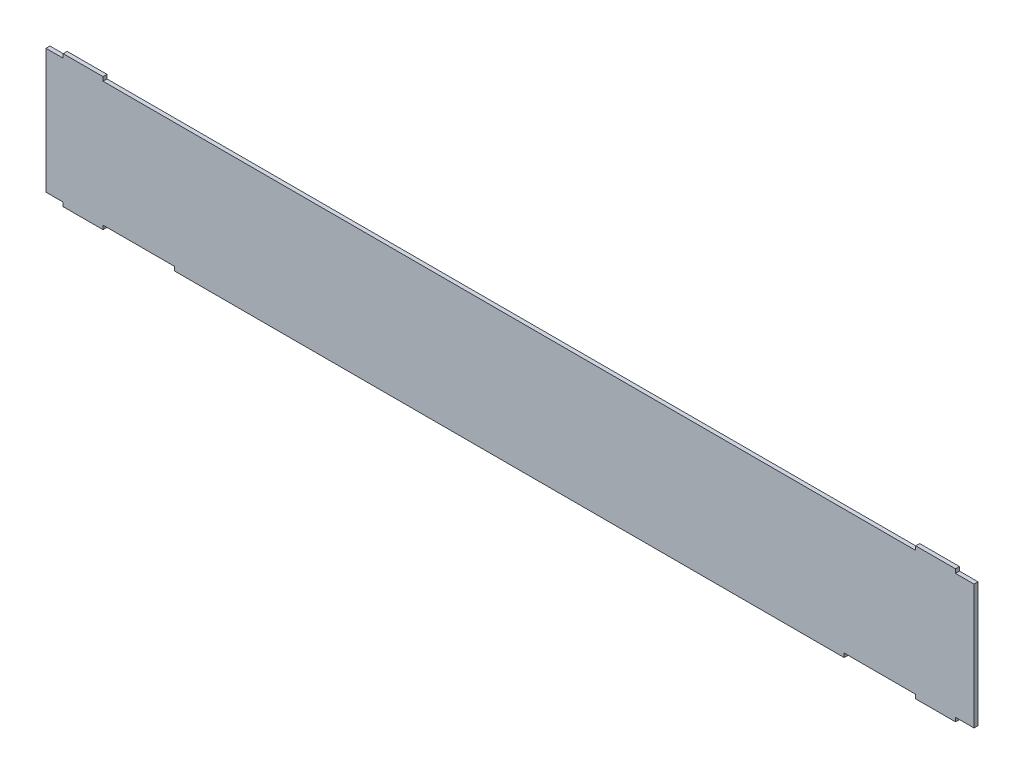
ISO-10303-21;
HEADER;
FILE_DESCRIPTION(('STEP AP214'),'2;1');
FILE_NAME('part.step','',(''),(''),'','','');
FILE_SCHEMA(('AUTOMOTIVE_DESIGN { 1 0 10303 214 1 1 1 1 }'));
ENDSEC;
DATA;
#1=APPLICATION_CONTEXT('core data for automotive mechanical design processes');
#2=APPLICATION_PROTOCOL_DEFINITION('international standard','automotive_design',2000,#1);
#3=PRODUCT_CONTEXT('',#1,'mechanical');
#4=PRODUCT('Part','Part','',(#3));
#5=PRODUCT_RELATED_PRODUCT_CATEGORY('part','',(#4));
#6=PRODUCT_DEFINITION_FORMATION('','',#4);
#7=PRODUCT_DEFINITION_CONTEXT('part definition',#1,'design');
#8=PRODUCT_DEFINITION('design','',#6,#7);
#9=PRODUCT_DEFINITION_SHAPE('','',#8);
#10=(LENGTH_UNIT() NAMED_UNIT(*) SI_UNIT(.MILLI.,.METRE.));
#11=(NAMED_UNIT(*) PLANE_ANGLE_UNIT() SI_UNIT($,.RADIAN.));
#12=(NAMED_UNIT(*) SI_UNIT($,.STERADIAN.) SOLID_ANGLE_UNIT());
#13=UNCERTAINTY_MEASURE_WITH_UNIT(LENGTH_MEASURE(1.E-05),#10,'distance_accuracy_value','');
#14=(GEOMETRIC_REPRESENTATION_CONTEXT(3) GLOBAL_UNCERTAINTY_ASSIGNED_CONTEXT((#13)) GLOBAL_UNIT_ASSIGNED_CONTEXT((#10,
#11,#12)) REPRESENTATION_CONTEXT('',''));
#15=CARTESIAN_POINT('',(0.,0.,0.));
#16=DIRECTION('',(0.,0.,1.));
#17=DIRECTION('',(1.,0.,0.));
#18=AXIS2_PLACEMENT_3D('',#15,#16,#17);
#19=CARTESIAN_POINT('',(0.,100.,3.));
#20=DIRECTION('',(0.,-1.,0.));
#21=DIRECTION('',(0.,0.,-1.));
#22=AXIS2_PLACEMENT_3D('',#19,#20,#21);
#23=PLANE('',#22);
#24=DIRECTION('',(-1.,0.,0.));
#25=VECTOR('',#24,1.);
#26=CARTESIAN_POINT('',(0.,100.,3.));
#27=LINE('',#26,#25);
#28=CARTESIAN_POINT('',(43.,100.,3.));
#29=VERTEX_POINT('',#28);
#30=CARTESIAN_POINT('',(13.,100.,3.));
#31=VERTEX_POINT('',#30);
#32=EDGE_CURVE('E43',#29,#31,#27,.T.);
#33=ORIENTED_EDGE('',*,*,#32,.F.);
#34=DIRECTION('',(0.,0.,-1.));
#35=VECTOR('',#34,1.);
#36=CARTESIAN_POINT('',(43.,100.,10.));
#37=LINE('',#36,#35);
#38=CARTESIAN_POINT('',(43.,100.,0.));
#39=VERTEX_POINT('',#38);
#40=EDGE_CURVE('E203',#29,#39,#37,.T.);
#41=ORIENTED_EDGE('',*,*,#40,.T.);
#42=DIRECTION('',(-1.,0.,0.));
#43=VECTOR('',#42,1.);
#44=CARTESIAN_POINT('',(0.,100.,0.));
#45=LINE('',#44,#43);
#46=CARTESIAN_POINT('',(13.,100.,0.));
#47=VERTEX_POINT('',#46);
#48=EDGE_CURVE('E51',#39,#47,#45,.T.);
#49=ORIENTED_EDGE('',*,*,#48,.T.);
#50=DIRECTION('',(0.,0.,-1.));
#51=VECTOR('',#50,1.);
#52=CARTESIAN_POINT('',(13.,100.,10.));
#53=LINE('',#52,#51);
#54=EDGE_CURVE('E369',#31,#47,#53,.T.);
#55=ORIENTED_EDGE('',*,*,#54,.F.);
#56=EDGE_LOOP('',(#33,#41,#49,#55));
#57=FACE_BOUND('',#56,.T.);
#58=ADVANCED_FACE('F34',(#57),#23,.F.);
#59=CARTESIAN_POINT('',(686.,100.,0.));
#60=VERTEX_POINT('',#59);
#61=CARTESIAN_POINT('',(656.,100.,0.));
#62=VERTEX_POINT('',#61);
#63=EDGE_CURVE('E38',#60,#62,#45,.T.);
#64=ORIENTED_EDGE('',*,*,#63,.T.);
#65=DIRECTION('',(0.,0.,-1.));
#66=VECTOR('',#65,1.);
#67=CARTESIAN_POINT('',(656.,100.,10.));
#68=LINE('',#67,#66);
#69=CARTESIAN_POINT('',(656.,100.,3.));
#70=VERTEX_POINT('',#69);
#71=EDGE_CURVE('E355',#70,#62,#68,.T.);
#72=ORIENTED_EDGE('',*,*,#71,.F.);
#73=CARTESIAN_POINT('',(686.,100.,3.));
#74=VERTEX_POINT('',#73);
#75=EDGE_CURVE('E11',#74,#70,#27,.T.);
#76=ORIENTED_EDGE('',*,*,#75,.F.);
#77=DIRECTION('',(0.,0.,-1.));
#78=VECTOR('',#77,1.);
#79=CARTESIAN_POINT('',(686.,100.,10.));
#80=LINE('',#79,#78);
#81=EDGE_CURVE('E338',#74,#60,#80,.T.);
#82=ORIENTED_EDGE('',*,*,#81,.T.);
#83=EDGE_LOOP('',(#64,#72,#76,#82));
#84=FACE_BOUND('',#83,.T.);
#85=ADVANCED_FACE('F389',(#84),#23,.F.);
#86=CARTESIAN_POINT('',(0.,0.,3.));
#87=DIRECTION('',(0.,1.,0.));
#88=DIRECTION('',(0.,0.,1.));
#89=AXIS2_PLACEMENT_3D('',#86,#87,#88);
#90=PLANE('',#89);
#91=DIRECTION('',(1.,0.,0.));
#92=VECTOR('',#91,1.);
#93=CARTESIAN_POINT('',(0.,0.,0.));
#94=LINE('',#93,#92);
#95=CARTESIAN_POINT('',(13.,0.,0.));
#96=VERTEX_POINT('',#95);
#97=CARTESIAN_POINT('',(43.,0.,0.));
#98=VERTEX_POINT('',#97);
#99=EDGE_CURVE('E221',#96,#98,#94,.T.);
#100=ORIENTED_EDGE('',*,*,#99,.T.);
#101=DIRECTION('',(0.,0.,-1.));
#102=VECTOR('',#101,1.);
#103=CARTESIAN_POINT('',(43.,0.,10.));
#104=LINE('',#103,#102);
#105=CARTESIAN_POINT('',(43.,0.,3.));
#106=VERTEX_POINT('',#105);
#107=EDGE_CURVE('E315',#106,#98,#104,.T.);
#108=ORIENTED_EDGE('',*,*,#107,.F.);
#109=DIRECTION('',(1.,0.,0.));
#110=VECTOR('',#109,1.);
#111=CARTESIAN_POINT('',(0.,0.,3.));
#112=LINE('',#111,#110);
#113=CARTESIAN_POINT('',(13.,0.,3.));
#114=VERTEX_POINT('',#113);
#115=EDGE_CURVE('E237',#114,#106,#112,.T.);
#116=ORIENTED_EDGE('',*,*,#115,.F.);
#117=DIRECTION('',(0.,0.,-1.));
#118=VECTOR('',#117,1.);
#119=CARTESIAN_POINT('',(13.,0.,10.));
#120=LINE('',#119,#118);
#121=EDGE_CURVE('E293',#114,#96,#120,.T.);
#122=ORIENTED_EDGE('',*,*,#121,.T.);
#123=EDGE_LOOP('',(#100,#108,#116,#122));
#124=FACE_BOUND('',#123,.T.);
#125=ADVANCED_FACE('F445',(#124),#90,.F.);
#126=CARTESIAN_POINT('',(656.,0.,3.));
#127=VERTEX_POINT('',#126);
#128=CARTESIAN_POINT('',(686.,0.,3.));
#129=VERTEX_POINT('',#128);
#130=EDGE_CURVE('E241',#127,#129,#112,.T.);
#131=ORIENTED_EDGE('',*,*,#130,.F.);
#132=DIRECTION('',(0.,0.,-1.));
#133=VECTOR('',#132,1.);
#134=CARTESIAN_POINT('',(656.,0.,10.));
#135=LINE('',#134,#133);
#136=CARTESIAN_POINT('',(656.,0.,0.));
#137=VERTEX_POINT('',#136);
#138=EDGE_CURVE('E270',#127,#137,#135,.T.);
#139=ORIENTED_EDGE('',*,*,#138,.T.);
#140=CARTESIAN_POINT('',(686.,0.,0.));
#141=VERTEX_POINT('',#140);
#142=EDGE_CURVE('E229',#137,#141,#94,.T.);
#143=ORIENTED_EDGE('',*,*,#142,.T.);
#144=DIRECTION('',(0.,0.,-1.));
#145=VECTOR('',#144,1.);
#146=CARTESIAN_POINT('',(686.,0.,10.));
#147=LINE('',#146,#145);
#148=EDGE_CURVE('E249',#129,#141,#147,.T.);
#149=ORIENTED_EDGE('',*,*,#148,.F.);
#150=EDGE_LOOP('',(#131,#139,#143,#149));
#151=FACE_BOUND('',#150,.T.);
#152=ADVANCED_FACE('F411',(#151),#90,.F.);
#153=CARTESIAN_POINT('',(0.,0.,3.));
#154=DIRECTION('',(1.,0.,0.));
#155=DIRECTION('',(0.,0.,-1.));
#156=AXIS2_PLACEMENT_3D('',#153,#154,#155);
#157=PLANE('',#156);
#158=DIRECTION('',(0.,-1.,0.));
#159=VECTOR('',#158,1.);
#160=CARTESIAN_POINT('',(0.,0.,3.));
#161=LINE('',#160,#159);
#162=CARTESIAN_POINT('',(0.,97.,3.));
#163=VERTEX_POINT('',#162);
#164=CARTESIAN_POINT('',(0.,3.,3.));
#165=VERTEX_POINT('',#164);
#166=EDGE_CURVE('E219',#163,#165,#161,.T.);
#167=ORIENTED_EDGE('',*,*,#166,.F.);
#168=DIRECTION('',(0.,0.,-1.));
#169=VECTOR('',#168,1.);
#170=CARTESIAN_POINT('',(0.,97.,10.));
#171=LINE('',#170,#169);
#172=CARTESIAN_POINT('',(0.,97.,0.));
#173=VERTEX_POINT('',#172);
#174=EDGE_CURVE('E368',#163,#173,#171,.T.);
#175=ORIENTED_EDGE('',*,*,#174,.T.);
#176=DIRECTION('',(0.,-1.,0.));
#177=VECTOR('',#176,1.);
#178=CARTESIAN_POINT('',(0.,0.,0.));
#179=LINE('',#178,#177);
#180=CARTESIAN_POINT('',(0.,3.,0.));
#181=VERTEX_POINT('',#180);
#182=EDGE_CURVE('E231',#173,#181,#179,.T.);
#183=ORIENTED_EDGE('',*,*,#182,.T.);
#184=DIRECTION('',(0.,0.,-1.));
#185=VECTOR('',#184,1.);
#186=CARTESIAN_POINT('',(0.,3.,10.));
#187=LINE('',#186,#185);
#188=EDGE_CURVE('E294',#165,#181,#187,.T.);
#189=ORIENTED_EDGE('',*,*,#188,.F.);
#190=EDGE_LOOP('',(#167,#175,#183,#189));
#191=FACE_BOUND('',#190,.T.);
#192=ADVANCED_FACE('F36',(#191),#157,.F.);
#193=CARTESIAN_POINT('',(97.,0.,3.));
#194=VERTEX_POINT('',#193);
#195=CARTESIAN_POINT('',(602.,0.,3.));
#196=VERTEX_POINT('',#195);
#197=EDGE_CURVE('E240',#194,#196,#112,.T.);
#198=ORIENTED_EDGE('',*,*,#197,.F.);
#199=DIRECTION('',(0.,0.,-1.));
#200=VECTOR('',#199,1.);
#201=CARTESIAN_POINT('',(97.,0.,10.));
#202=LINE('',#201,#200);
#203=CARTESIAN_POINT('',(97.,0.,0.));
#204=VERTEX_POINT('',#203);
#205=EDGE_CURVE('E322',#194,#204,#202,.T.);
#206=ORIENTED_EDGE('',*,*,#205,.T.);
#207=CARTESIAN_POINT('',(602.,0.,0.));
#208=VERTEX_POINT('',#207);
#209=EDGE_CURVE('E227',#204,#208,#94,.T.);
#210=ORIENTED_EDGE('',*,*,#209,.T.);
#211=DIRECTION('',(0.,0.,-1.));
#212=VECTOR('',#211,1.);
#213=CARTESIAN_POINT('',(602.,0.,10.));
#214=LINE('',#213,#212);
#215=EDGE_CURVE('E273',#196,#208,#214,.T.);
#216=ORIENTED_EDGE('',*,*,#215,.F.);
#217=EDGE_LOOP('',(#198,#206,#210,#216));
#218=FACE_BOUND('',#217,.T.);
#219=ADVANCED_FACE('F417',(#218),#90,.F.);
#220=CARTESIAN_POINT('',(700.,0.,3.));
#221=DIRECTION('',(-1.,0.,0.));
#222=DIRECTION('',(0.,0.,1.));
#223=AXIS2_PLACEMENT_3D('',#220,#221,#222);
#224=PLANE('',#223);
#225=DIRECTION('',(0.,1.,0.));
#226=VECTOR('',#225,1.);
#227=CARTESIAN_POINT('',(700.,0.,0.));
#228=LINE('',#227,#226);
#229=CARTESIAN_POINT('',(700.,3.,0.));
#230=VERTEX_POINT('',#229);
#231=CARTESIAN_POINT('',(700.,97.,0.));
#232=VERTEX_POINT('',#231);
#233=EDGE_CURVE('E217',#230,#232,#228,.T.);
#234=ORIENTED_EDGE('',*,*,#233,.T.);
#235=DIRECTION('',(0.,0.,-1.));
#236=VECTOR('',#235,1.);
#237=CARTESIAN_POINT('',(700.,97.,10.));
#238=LINE('',#237,#236);
#239=CARTESIAN_POINT('',(700.,97.,3.));
#240=VERTEX_POINT('',#239);
#241=EDGE_CURVE('E339',#240,#232,#238,.T.);
#242=ORIENTED_EDGE('',*,*,#241,.F.);
#243=DIRECTION('',(0.,1.,0.));
#244=VECTOR('',#243,1.);
#245=CARTESIAN_POINT('',(700.,0.,3.));
#246=LINE('',#245,#244);
#247=CARTESIAN_POINT('',(700.,3.,3.));
#248=VERTEX_POINT('',#247);
#249=EDGE_CURVE('E234',#248,#240,#246,.T.);
#250=ORIENTED_EDGE('',*,*,#249,.F.);
#251=DIRECTION('',(0.,0.,-1.));
#252=VECTOR('',#251,1.);
#253=CARTESIAN_POINT('',(700.,3.,10.));
#254=LINE('',#253,#252);
#255=EDGE_CURVE('E248',#248,#230,#254,.T.);
#256=ORIENTED_EDGE('',*,*,#255,.T.);
#257=EDGE_LOOP('',(#234,#242,#250,#256));
#258=FACE_BOUND('',#257,.T.);
#259=ADVANCED_FACE('F398',(#258),#224,.F.);
#260=CARTESIAN_POINT('',(0.,0.,3.));
#261=DIRECTION('',(0.,0.,-1.));
#262=DIRECTION('',(-1.,0.,0.));
#263=AXIS2_PLACEMENT_3D('',#260,#261,#262);
#264=PLANE('',#263);
#265=DIRECTION('',(-1.,0.,0.));
#266=VECTOR('',#265,1.);
#267=CARTESIAN_POINT('',(0.,97.0000000000002,3.));
#268=LINE('',#267,#266);
#269=CARTESIAN_POINT('',(656.,97.,3.));
#270=VERTEX_POINT('',#269);
#271=CARTESIAN_POINT('',(43.0000000000001,97.,3.));
#272=VERTEX_POINT('',#271);
#273=EDGE_CURVE('E353',#270,#272,#268,.T.);
#274=ORIENTED_EDGE('',*,*,#273,.T.);
#275=DIRECTION('',(0.,1.,0.));
#276=VECTOR('',#275,1.);
#277=CARTESIAN_POINT('',(43.0000000000014,5.96744875736041E-13,3.));
#278=LINE('',#277,#276);
#279=EDGE_CURVE('E378',#272,#29,#278,.T.);
#280=ORIENTED_EDGE('',*,*,#279,.T.);
#281=ORIENTED_EDGE('',*,*,#32,.T.);
#282=DIRECTION('',(0.,-1.,0.));
#283=VECTOR('',#282,1.);
#284=CARTESIAN_POINT('',(13.0000000000001,0.,3.));
#285=LINE('',#284,#283);
#286=CARTESIAN_POINT('',(13.,97.,3.));
#287=VERTEX_POINT('',#286);
#288=EDGE_CURVE('E365',#31,#287,#285,.T.);
#289=ORIENTED_EDGE('',*,*,#288,.T.);
#290=DIRECTION('',(-1.,0.,0.));
#291=VECTOR('',#290,1.);
#292=CARTESIAN_POINT('',(0.,97.,3.));
#293=LINE('',#292,#291);
#294=EDGE_CURVE('E362',#287,#163,#293,.T.);
#295=ORIENTED_EDGE('',*,*,#294,.T.);
#296=ORIENTED_EDGE('',*,*,#166,.T.);
#297=DIRECTION('',(1.,0.,0.));
#298=VECTOR('',#297,1.);
#299=CARTESIAN_POINT('',(0.,3.,3.));
#300=LINE('',#299,#298);
#301=CARTESIAN_POINT('',(13.,3.,3.));
#302=VERTEX_POINT('',#301);
#303=EDGE_CURVE('E290',#165,#302,#300,.T.);
#304=ORIENTED_EDGE('',*,*,#303,.T.);
#305=DIRECTION('',(0.,-1.,0.));
#306=VECTOR('',#305,1.);
#307=CARTESIAN_POINT('',(13.,0.,3.));
#308=LINE('',#307,#306);
#309=EDGE_CURVE('E287',#302,#114,#308,.T.);
#310=ORIENTED_EDGE('',*,*,#309,.T.);
#311=ORIENTED_EDGE('',*,*,#115,.T.);
#312=DIRECTION('',(0.,1.,0.));
#313=VECTOR('',#312,1.);
#314=CARTESIAN_POINT('',(43.,0.,3.));
#315=LINE('',#314,#313);
#316=CARTESIAN_POINT('',(43.,2.99999999999997,3.));
#317=VERTEX_POINT('',#316);
#318=EDGE_CURVE('E306',#106,#317,#315,.T.);
#319=ORIENTED_EDGE('',*,*,#318,.T.);
#320=DIRECTION('',(1.,0.,0.));
#321=VECTOR('',#320,1.);
#322=CARTESIAN_POINT('',(0.,2.99999999999996,3.));
#323=LINE('',#322,#321);
#324=CARTESIAN_POINT('',(97.,2.99999999999998,3.));
#325=VERTEX_POINT('',#324);
#326=EDGE_CURVE('E312',#317,#325,#323,.T.);
#327=ORIENTED_EDGE('',*,*,#326,.T.);
#328=DIRECTION('',(0.,-1.,0.));
#329=VECTOR('',#328,1.);
#330=CARTESIAN_POINT('',(97.,0.,3.));
#331=LINE('',#330,#329);
#332=EDGE_CURVE('E309',#325,#194,#331,.T.);
#333=ORIENTED_EDGE('',*,*,#332,.T.);
#334=ORIENTED_EDGE('',*,*,#197,.T.);
#335=DIRECTION('',(0.,1.,0.));
#336=VECTOR('',#335,1.);
#337=CARTESIAN_POINT('',(602.,0.,3.));
#338=LINE('',#337,#336);
#339=CARTESIAN_POINT('',(602.,3.,3.));
#340=VERTEX_POINT('',#339);
#341=EDGE_CURVE('E266',#196,#340,#338,.T.);
#342=ORIENTED_EDGE('',*,*,#341,.T.);
#343=DIRECTION('',(1.,0.,0.));
#344=VECTOR('',#343,1.);
#345=CARTESIAN_POINT('',(0.,3.,3.));
#346=LINE('',#345,#344);
#347=CARTESIAN_POINT('',(656.,3.,3.));
#348=VERTEX_POINT('',#347);
#349=EDGE_CURVE('E263',#340,#348,#346,.T.);
#350=ORIENTED_EDGE('',*,*,#349,.T.);
#351=DIRECTION('',(0.,-1.,0.));
#352=VECTOR('',#351,1.);
#353=CARTESIAN_POINT('',(656.,0.,3.));
#354=LINE('',#353,#352);
#355=EDGE_CURVE('E260',#348,#127,#354,.T.);
#356=ORIENTED_EDGE('',*,*,#355,.T.);
#357=ORIENTED_EDGE('',*,*,#130,.T.);
#358=DIRECTION('',(0.,1.,0.));
#359=VECTOR('',#358,1.);
#360=CARTESIAN_POINT('',(686.,0.,3.));
#361=LINE('',#360,#359);
#362=CARTESIAN_POINT('',(686.,3.,3.));
#363=VERTEX_POINT('',#362);
#364=EDGE_CURVE('E245',#129,#363,#361,.T.);
#365=ORIENTED_EDGE('',*,*,#364,.T.);
#366=DIRECTION('',(1.,0.,0.));
#367=VECTOR('',#366,1.);
#368=CARTESIAN_POINT('',(0.,3.00000000000004,3.));
#369=LINE('',#368,#367);
#370=EDGE_CURVE('E232',#363,#248,#369,.T.);
#371=ORIENTED_EDGE('',*,*,#370,.T.);
#372=ORIENTED_EDGE('',*,*,#249,.T.);
#373=DIRECTION('',(-1.,0.,0.));
#374=VECTOR('',#373,1.);
#375=CARTESIAN_POINT('',(0.,97.,3.));
#376=LINE('',#375,#374);
#377=CARTESIAN_POINT('',(686.,97.,3.));
#378=VERTEX_POINT('',#377);
#379=EDGE_CURVE('E335',#240,#378,#376,.T.);
#380=ORIENTED_EDGE('',*,*,#379,.T.);
#381=DIRECTION('',(0.,1.,0.));
#382=VECTOR('',#381,1.);
#383=CARTESIAN_POINT('',(686.,0.,3.));
#384=LINE('',#383,#382);
#385=EDGE_CURVE('E332',#378,#74,#384,.T.);
#386=ORIENTED_EDGE('',*,*,#385,.T.);
#387=ORIENTED_EDGE('',*,*,#75,.T.);
#388=DIRECTION('',(0.,-1.,0.));
#389=VECTOR('',#388,1.);
#390=CARTESIAN_POINT('',(656.,0.,3.));
#391=LINE('',#390,#389);
#392=EDGE_CURVE('E350',#70,#270,#391,.T.);
#393=ORIENTED_EDGE('',*,*,#392,.T.);
#394=EDGE_LOOP('',(#274,#280,#281,#289,#295,#296,#304,#310,#311,#319,#327,#333,#334,#342,#350,
#356,#357,#365,#371,#372,#380,#386,#387,#393));
#395=FACE_BOUND('',#394,.T.);
#396=ADVANCED_FACE('F381',(#395),#264,.F.);
#397=CARTESIAN_POINT('',(0.,0.,0.));
#398=DIRECTION('',(0.,0.,-1.));
#399=DIRECTION('',(-1.,0.,0.));
#400=AXIS2_PLACEMENT_3D('',#397,#398,#399);
#401=PLANE('',#400);
#402=DIRECTION('',(0.,1.,0.));
#403=VECTOR('',#402,1.);
#404=CARTESIAN_POINT('',(43.,100.,0.));
#405=LINE('',#404,#403);
#406=CARTESIAN_POINT('',(43.0000000000001,97.,0.));
#407=VERTEX_POINT('',#406);
#408=EDGE_CURVE('E200',#407,#39,#405,.T.);
#409=ORIENTED_EDGE('',*,*,#408,.F.);
#410=DIRECTION('',(-1.,0.,0.));
#411=VECTOR('',#410,1.);
#412=CARTESIAN_POINT('',(656.,97.,0.));
#413=LINE('',#412,#411);
#414=CARTESIAN_POINT('',(656.,97.,0.));
#415=VERTEX_POINT('',#414);
#416=EDGE_CURVE('E358',#415,#407,#413,.T.);
#417=ORIENTED_EDGE('',*,*,#416,.F.);
#418=DIRECTION('',(0.,-1.,0.));
#419=VECTOR('',#418,1.);
#420=CARTESIAN_POINT('',(656.,100.,0.));
#421=LINE('',#420,#419);
#422=EDGE_CURVE('E59',#62,#415,#421,.T.);
#423=ORIENTED_EDGE('',*,*,#422,.F.);
#424=ORIENTED_EDGE('',*,*,#63,.F.);
#425=DIRECTION('',(0.,1.,0.));
#426=VECTOR('',#425,1.);
#427=CARTESIAN_POINT('',(686.,100.,0.));
#428=LINE('',#427,#426);
#429=CARTESIAN_POINT('',(686.,97.,0.));
#430=VERTEX_POINT('',#429);
#431=EDGE_CURVE('E342',#430,#60,#428,.T.);
#432=ORIENTED_EDGE('',*,*,#431,.F.);
#433=DIRECTION('',(-1.,0.,0.));
#434=VECTOR('',#433,1.);
#435=CARTESIAN_POINT('',(700.,97.,0.));
#436=LINE('',#435,#434);
#437=EDGE_CURVE('E347',#232,#430,#436,.T.);
#438=ORIENTED_EDGE('',*,*,#437,.F.);
#439=ORIENTED_EDGE('',*,*,#233,.F.);
#440=DIRECTION('',(1.,0.,0.));
#441=VECTOR('',#440,1.);
#442=CARTESIAN_POINT('',(700.,3.,0.));
#443=LINE('',#442,#441);
#444=CARTESIAN_POINT('',(686.,3.,0.));
#445=VERTEX_POINT('',#444);
#446=EDGE_CURVE('E253',#445,#230,#443,.T.);
#447=ORIENTED_EDGE('',*,*,#446,.F.);
#448=DIRECTION('',(0.,1.,0.));
#449=VECTOR('',#448,1.);
#450=CARTESIAN_POINT('',(686.,0.,0.));
#451=LINE('',#450,#449);
#452=EDGE_CURVE('E257',#141,#445,#451,.T.);
#453=ORIENTED_EDGE('',*,*,#452,.F.);
#454=ORIENTED_EDGE('',*,*,#142,.F.);
#455=DIRECTION('',(0.,-1.,0.));
#456=VECTOR('',#455,1.);
#457=CARTESIAN_POINT('',(656.,0.,0.));
#458=LINE('',#457,#456);
#459=CARTESIAN_POINT('',(656.,3.,0.));
#460=VERTEX_POINT('',#459);
#461=EDGE_CURVE('E285',#460,#137,#458,.T.);
#462=ORIENTED_EDGE('',*,*,#461,.F.);
#463=DIRECTION('',(1.,0.,0.));
#464=VECTOR('',#463,1.);
#465=CARTESIAN_POINT('',(656.,3.,0.));
#466=LINE('',#465,#464);
#467=CARTESIAN_POINT('',(602.,3.,0.));
#468=VERTEX_POINT('',#467);
#469=EDGE_CURVE('E274',#468,#460,#466,.T.);
#470=ORIENTED_EDGE('',*,*,#469,.F.);
#471=DIRECTION('',(0.,1.,0.));
#472=VECTOR('',#471,1.);
#473=CARTESIAN_POINT('',(602.,0.,0.));
#474=LINE('',#473,#472);
#475=EDGE_CURVE('E282',#208,#468,#474,.T.);
#476=ORIENTED_EDGE('',*,*,#475,.F.);
#477=ORIENTED_EDGE('',*,*,#209,.F.);
#478=DIRECTION('',(0.,-1.,0.));
#479=VECTOR('',#478,1.);
#480=CARTESIAN_POINT('',(97.,0.,0.));
#481=LINE('',#480,#479);
#482=CARTESIAN_POINT('',(97.,2.99999999999998,0.));
#483=VERTEX_POINT('',#482);
#484=EDGE_CURVE('E320',#483,#204,#481,.T.);
#485=ORIENTED_EDGE('',*,*,#484,.F.);
#486=DIRECTION('',(1.,0.,0.));
#487=VECTOR('',#486,1.);
#488=CARTESIAN_POINT('',(43.,2.99999999999997,0.));
#489=LINE('',#488,#487);
#490=CARTESIAN_POINT('',(43.,2.99999999999997,0.));
#491=VERTEX_POINT('',#490);
#492=EDGE_CURVE('E327',#491,#483,#489,.T.);
#493=ORIENTED_EDGE('',*,*,#492,.F.);
#494=DIRECTION('',(0.,1.,0.));
#495=VECTOR('',#494,1.);
#496=CARTESIAN_POINT('',(43.,0.,0.));
#497=LINE('',#496,#495);
#498=EDGE_CURVE('E330',#98,#491,#497,.T.);
#499=ORIENTED_EDGE('',*,*,#498,.F.);
#500=ORIENTED_EDGE('',*,*,#99,.F.);
#501=DIRECTION('',(0.,-1.,0.));
#502=VECTOR('',#501,1.);
#503=CARTESIAN_POINT('',(13.,0.,0.));
#504=LINE('',#503,#502);
#505=CARTESIAN_POINT('',(13.,3.,0.));
#506=VERTEX_POINT('',#505);
#507=EDGE_CURVE('E298',#506,#96,#504,.T.);
#508=ORIENTED_EDGE('',*,*,#507,.F.);
#509=DIRECTION('',(1.,0.,0.));
#510=VECTOR('',#509,1.);
#511=CARTESIAN_POINT('',(0.,3.,0.));
#512=LINE('',#511,#510);
#513=EDGE_CURVE('E303',#181,#506,#512,.T.);
#514=ORIENTED_EDGE('',*,*,#513,.F.);
#515=ORIENTED_EDGE('',*,*,#182,.F.);
#516=DIRECTION('',(-1.,0.,0.));
#517=VECTOR('',#516,1.);
#518=CARTESIAN_POINT('',(0.,97.,0.));
#519=LINE('',#518,#517);
#520=CARTESIAN_POINT('',(13.,97.,0.));
#521=VERTEX_POINT('',#520);
#522=EDGE_CURVE('E372',#521,#173,#519,.T.);
#523=ORIENTED_EDGE('',*,*,#522,.F.);
#524=DIRECTION('',(0.,-1.,0.));
#525=VECTOR('',#524,1.);
#526=CARTESIAN_POINT('',(13.,100.,0.));
#527=LINE('',#526,#525);
#528=EDGE_CURVE('E216',#47,#521,#527,.T.);
#529=ORIENTED_EDGE('',*,*,#528,.F.);
#530=ORIENTED_EDGE('',*,*,#48,.F.);
#531=EDGE_LOOP('',(#409,#417,#423,#424,#432,#438,#439,#447,#453,#454,#462,#470,#476,#477,#485,
#493,#499,#500,#508,#514,#515,#523,#529,#530));
#532=FACE_BOUND('',#531,.T.);
#533=ADVANCED_FACE('F213',(#532),#401,.T.);
#534=CARTESIAN_POINT('',(700.,3.,10.));
#535=DIRECTION('',(0.,1.,0.));
#536=DIRECTION('',(-1.,0.,0.));
#537=AXIS2_PLACEMENT_3D('',#534,#535,#536);
#538=PLANE('',#537);
#539=DIRECTION('',(0.,0.,-1.));
#540=VECTOR('',#539,1.);
#541=CARTESIAN_POINT('',(686.,3.,10.));
#542=LINE('',#541,#540);
#543=EDGE_CURVE('E252',#363,#445,#542,.T.);
#544=ORIENTED_EDGE('',*,*,#543,.T.);
#545=ORIENTED_EDGE('',*,*,#446,.T.);
#546=ORIENTED_EDGE('',*,*,#255,.F.);
#547=ORIENTED_EDGE('',*,*,#370,.F.);
#548=EDGE_LOOP('',(#544,#545,#546,#547));
#549=FACE_BOUND('',#548,.T.);
#550=ADVANCED_FACE('F403',(#549),#538,.F.);
#551=CARTESIAN_POINT('',(686.,0.,10.));
#552=DIRECTION('',(-1.,0.,0.));
#553=DIRECTION('',(0.,0.,1.));
#554=AXIS2_PLACEMENT_3D('',#551,#552,#553);
#555=PLANE('',#554);
#556=ORIENTED_EDGE('',*,*,#148,.T.);
#557=ORIENTED_EDGE('',*,*,#452,.T.);
#558=ORIENTED_EDGE('',*,*,#543,.F.);
#559=ORIENTED_EDGE('',*,*,#364,.F.);
#560=EDGE_LOOP('',(#556,#557,#558,#559));
#561=FACE_BOUND('',#560,.T.);
#562=ADVANCED_FACE('F407',(#561),#555,.F.);
#563=CARTESIAN_POINT('',(656.,0.,10.));
#564=DIRECTION('',(1.,0.,0.));
#565=DIRECTION('',(0.,0.,-1.));
#566=AXIS2_PLACEMENT_3D('',#563,#564,#565);
#567=PLANE('',#566);
#568=DIRECTION('',(0.,0.,-1.));
#569=VECTOR('',#568,1.);
#570=CARTESIAN_POINT('',(656.,3.,10.));
#571=LINE('',#570,#569);
#572=EDGE_CURVE('E269',#348,#460,#571,.T.);
#573=ORIENTED_EDGE('',*,*,#572,.T.);
#574=ORIENTED_EDGE('',*,*,#461,.T.);
#575=ORIENTED_EDGE('',*,*,#138,.F.);
#576=ORIENTED_EDGE('',*,*,#355,.F.);
#577=EDGE_LOOP('',(#573,#574,#575,#576));
#578=FACE_BOUND('',#577,.T.);
#579=ADVANCED_FACE('F429',(#578),#567,.F.);
#580=CARTESIAN_POINT('',(656.,3.,10.));
#581=DIRECTION('',(0.,1.,0.));
#582=DIRECTION('',(0.,0.,1.));
#583=AXIS2_PLACEMENT_3D('',#580,#581,#582);
#584=PLANE('',#583);
#585=DIRECTION('',(0.,0.,-1.));
#586=VECTOR('',#585,1.);
#587=CARTESIAN_POINT('',(602.,3.,10.));
#588=LINE('',#587,#586);
#589=EDGE_CURVE('E277',#340,#468,#588,.T.);
#590=ORIENTED_EDGE('',*,*,#589,.T.);
#591=ORIENTED_EDGE('',*,*,#469,.T.);
#592=ORIENTED_EDGE('',*,*,#572,.F.);
#593=ORIENTED_EDGE('',*,*,#349,.F.);
#594=EDGE_LOOP('',(#590,#591,#592,#593));
#595=FACE_BOUND('',#594,.T.);
#596=ADVANCED_FACE('F427',(#595),#584,.F.);
#597=CARTESIAN_POINT('',(602.,0.,10.));
#598=DIRECTION('',(-1.,0.,0.));
#599=DIRECTION('',(0.,0.,1.));
#600=AXIS2_PLACEMENT_3D('',#597,#598,#599);
#601=PLANE('',#600);
#602=ORIENTED_EDGE('',*,*,#215,.T.);
#603=ORIENTED_EDGE('',*,*,#475,.T.);
#604=ORIENTED_EDGE('',*,*,#589,.F.);
#605=ORIENTED_EDGE('',*,*,#341,.F.);
#606=EDGE_LOOP('',(#602,#603,#604,#605));
#607=FACE_BOUND('',#606,.T.);
#608=ADVANCED_FACE('F422',(#607),#601,.F.);
#609=CARTESIAN_POINT('',(13.,0.,10.));
#610=DIRECTION('',(1.,0.,0.));
#611=DIRECTION('',(0.,0.,-1.));
#612=AXIS2_PLACEMENT_3D('',#609,#610,#611);
#613=PLANE('',#612);
#614=DIRECTION('',(0.,0.,-1.));
#615=VECTOR('',#614,1.);
#616=CARTESIAN_POINT('',(13.,3.,10.));
#617=LINE('',#616,#615);
#618=EDGE_CURVE('E297',#302,#506,#617,.T.);
#619=ORIENTED_EDGE('',*,*,#618,.T.);
#620=ORIENTED_EDGE('',*,*,#507,.T.);
#621=ORIENTED_EDGE('',*,*,#121,.F.);
#622=ORIENTED_EDGE('',*,*,#309,.F.);
#623=EDGE_LOOP('',(#619,#620,#621,#622));
#624=FACE_BOUND('',#623,.T.);
#625=ADVANCED_FACE('F581',(#624),#613,.F.);
#626=CARTESIAN_POINT('',(0.,3.,10.));
#627=DIRECTION('',(0.,1.,0.));
#628=DIRECTION('',(-1.,0.,0.));
#629=AXIS2_PLACEMENT_3D('',#626,#627,#628);
#630=PLANE('',#629);
#631=ORIENTED_EDGE('',*,*,#188,.T.);
#632=ORIENTED_EDGE('',*,*,#513,.T.);
#633=ORIENTED_EDGE('',*,*,#618,.F.);
#634=ORIENTED_EDGE('',*,*,#303,.F.);
#635=EDGE_LOOP('',(#631,#632,#633,#634));
#636=FACE_BOUND('',#635,.T.);
#637=ADVANCED_FACE('F573',(#636),#630,.F.);
#638=CARTESIAN_POINT('',(43.,0.,10.));
#639=DIRECTION('',(-1.,0.,0.));
#640=DIRECTION('',(0.,0.,1.));
#641=AXIS2_PLACEMENT_3D('',#638,#639,#640);
#642=PLANE('',#641);
#643=ORIENTED_EDGE('',*,*,#107,.T.);
#644=ORIENTED_EDGE('',*,*,#498,.T.);
#645=DIRECTION('',(0.,0.,-1.));
#646=VECTOR('',#645,1.);
#647=CARTESIAN_POINT('',(43.,2.99999999999997,10.));
#648=LINE('',#647,#646);
#649=EDGE_CURVE('E316',#317,#491,#648,.T.);
#650=ORIENTED_EDGE('',*,*,#649,.F.);
#651=ORIENTED_EDGE('',*,*,#318,.F.);
#652=EDGE_LOOP('',(#643,#644,#650,#651));
#653=FACE_BOUND('',#652,.T.);
#654=ADVANCED_FACE('F565',(#653),#642,.F.);
#655=CARTESIAN_POINT('',(97.,0.,10.));
#656=DIRECTION('',(1.,0.,0.));
#657=DIRECTION('',(0.,0.,-1.));
#658=AXIS2_PLACEMENT_3D('',#655,#656,#657);
#659=PLANE('',#658);
#660=DIRECTION('',(0.,0.,-1.));
#661=VECTOR('',#660,1.);
#662=CARTESIAN_POINT('',(97.,2.99999999999998,10.));
#663=LINE('',#662,#661);
#664=EDGE_CURVE('E319',#325,#483,#663,.T.);
#665=ORIENTED_EDGE('',*,*,#664,.T.);
#666=ORIENTED_EDGE('',*,*,#484,.T.);
#667=ORIENTED_EDGE('',*,*,#205,.F.);
#668=ORIENTED_EDGE('',*,*,#332,.F.);
#669=EDGE_LOOP('',(#665,#666,#667,#668));
#670=FACE_BOUND('',#669,.T.);
#671=ADVANCED_FACE('F557',(#670),#659,.F.);
#672=CARTESIAN_POINT('',(43.,2.99999999999997,10.));
#673=DIRECTION('',(0.,1.,0.));
#674=DIRECTION('',(-1.,0.,0.));
#675=AXIS2_PLACEMENT_3D('',#672,#673,#674);
#676=PLANE('',#675);
#677=ORIENTED_EDGE('',*,*,#649,.T.);
#678=ORIENTED_EDGE('',*,*,#492,.T.);
#679=ORIENTED_EDGE('',*,*,#664,.F.);
#680=ORIENTED_EDGE('',*,*,#326,.F.);
#681=EDGE_LOOP('',(#677,#678,#679,#680));
#682=FACE_BOUND('',#681,.T.);
#683=ADVANCED_FACE('F549',(#682),#676,.F.);
#684=CARTESIAN_POINT('',(686.,100.,10.));
#685=DIRECTION('',(-1.,0.,0.));
#686=DIRECTION('',(0.,0.,1.));
#687=AXIS2_PLACEMENT_3D('',#684,#685,#686);
#688=PLANE('',#687);
#689=DIRECTION('',(0.,0.,-1.));
#690=VECTOR('',#689,1.);
#691=CARTESIAN_POINT('',(686.,97.,10.));
#692=LINE('',#691,#690);
#693=EDGE_CURVE('E341',#378,#430,#692,.T.);
#694=ORIENTED_EDGE('',*,*,#693,.T.);
#695=ORIENTED_EDGE('',*,*,#431,.T.);
#696=ORIENTED_EDGE('',*,*,#81,.F.);
#697=ORIENTED_EDGE('',*,*,#385,.F.);
#698=EDGE_LOOP('',(#694,#695,#696,#697));
#699=FACE_BOUND('',#698,.T.);
#700=ADVANCED_FACE('F392',(#699),#688,.F.);
#701=CARTESIAN_POINT('',(700.,97.,10.));
#702=DIRECTION('',(0.,-1.,0.));
#703=DIRECTION('',(0.,0.,-1.));
#704=AXIS2_PLACEMENT_3D('',#701,#702,#703);
#705=PLANE('',#704);
#706=ORIENTED_EDGE('',*,*,#241,.T.);
#707=ORIENTED_EDGE('',*,*,#437,.T.);
#708=ORIENTED_EDGE('',*,*,#693,.F.);
#709=ORIENTED_EDGE('',*,*,#379,.F.);
#710=EDGE_LOOP('',(#706,#707,#708,#709));
#711=FACE_BOUND('',#710,.T.);
#712=ADVANCED_FACE('F396',(#711),#705,.F.);
#713=CARTESIAN_POINT('',(656.,100.,10.));
#714=DIRECTION('',(1.,0.,0.));
#715=DIRECTION('',(0.,0.,-1.));
#716=AXIS2_PLACEMENT_3D('',#713,#714,#715);
#717=PLANE('',#716);
#718=ORIENTED_EDGE('',*,*,#71,.T.);
#719=ORIENTED_EDGE('',*,*,#422,.T.);
#720=DIRECTION('',(0.,0.,-1.));
#721=VECTOR('',#720,1.);
#722=CARTESIAN_POINT('',(656.,97.,10.));
#723=LINE('',#722,#721);
#724=EDGE_CURVE('E356',#270,#415,#723,.T.);
#725=ORIENTED_EDGE('',*,*,#724,.F.);
#726=ORIENTED_EDGE('',*,*,#392,.F.);
#727=EDGE_LOOP('',(#718,#719,#725,#726));
#728=FACE_BOUND('',#727,.T.);
#729=ADVANCED_FACE('F474',(#728),#717,.F.);
#730=CARTESIAN_POINT('',(656.,97.,10.));
#731=DIRECTION('',(0.,-1.,0.));
#732=DIRECTION('',(1.,0.,0.));
#733=AXIS2_PLACEMENT_3D('',#730,#731,#732);
#734=PLANE('',#733);
#735=ORIENTED_EDGE('',*,*,#724,.T.);
#736=ORIENTED_EDGE('',*,*,#416,.T.);
#737=DIRECTION('',(0.,0.,-1.));
#738=VECTOR('',#737,1.);
#739=CARTESIAN_POINT('',(43.0000000000001,97.,10.));
#740=LINE('',#739,#738);
#741=EDGE_CURVE('E206',#272,#407,#740,.T.);
#742=ORIENTED_EDGE('',*,*,#741,.F.);
#743=ORIENTED_EDGE('',*,*,#273,.F.);
#744=EDGE_LOOP('',(#735,#736,#742,#743));
#745=FACE_BOUND('',#744,.T.);
#746=ADVANCED_FACE('F384',(#745),#734,.F.);
#747=CARTESIAN_POINT('',(0.,97.,10.));
#748=DIRECTION('',(0.,-1.,0.));
#749=DIRECTION('',(0.,0.,-1.));
#750=AXIS2_PLACEMENT_3D('',#747,#748,#749);
#751=PLANE('',#750);
#752=DIRECTION('',(0.,0.,-1.));
#753=VECTOR('',#752,1.);
#754=CARTESIAN_POINT('',(13.,97.,10.));
#755=LINE('',#754,#753);
#756=EDGE_CURVE('E371',#287,#521,#755,.T.);
#757=ORIENTED_EDGE('',*,*,#756,.T.);
#758=ORIENTED_EDGE('',*,*,#522,.T.);
#759=ORIENTED_EDGE('',*,*,#174,.F.);
#760=ORIENTED_EDGE('',*,*,#294,.F.);
#761=EDGE_LOOP('',(#757,#758,#759,#760));
#762=FACE_BOUND('',#761,.T.);
#763=ADVANCED_FACE('F479',(#762),#751,.F.);
#764=CARTESIAN_POINT('',(13.,100.,10.));
#765=DIRECTION('',(1.,0.,0.));
#766=DIRECTION('',(0.,1.,0.));
#767=AXIS2_PLACEMENT_3D('',#764,#765,#766);
#768=PLANE('',#767);
#769=ORIENTED_EDGE('',*,*,#54,.T.);
#770=ORIENTED_EDGE('',*,*,#528,.T.);
#771=ORIENTED_EDGE('',*,*,#756,.F.);
#772=ORIENTED_EDGE('',*,*,#288,.F.);
#773=EDGE_LOOP('',(#769,#770,#771,#772));
#774=FACE_BOUND('',#773,.T.);
#775=ADVANCED_FACE('F484',(#774),#768,.F.);
#776=CARTESIAN_POINT('',(43.,100.,10.));
#777=DIRECTION('',(-1.,0.,0.));
#778=DIRECTION('',(0.,-1.,0.));
#779=AXIS2_PLACEMENT_3D('',#776,#777,#778);
#780=PLANE('',#779);
#781=ORIENTED_EDGE('',*,*,#741,.T.);
#782=ORIENTED_EDGE('',*,*,#408,.T.);
#783=ORIENTED_EDGE('',*,*,#40,.F.);
#784=ORIENTED_EDGE('',*,*,#279,.F.);
#785=EDGE_LOOP('',(#781,#782,#783,#784));
#786=FACE_BOUND('',#785,.T.);
#787=ADVANCED_FACE('F201',(#786),#780,.F.);
#788=CLOSED_SHELL('',(#58,#85,#125,#152,#192,#219,#259,#396,#533,#550,#562,#579,#596,#608,#625,
#637,#654,#671,#683,#700,#712,#729,#746,#763,#775,#787));
#789=MANIFOLD_SOLID_BREP('B2',#788);
#790=ADVANCED_BREP_SHAPE_REPRESENTATION('',(#18,#789),#14);
#791=SHAPE_DEFINITION_REPRESENTATION(#9,#790);
ENDSEC;
END-ISO-10303-21;
